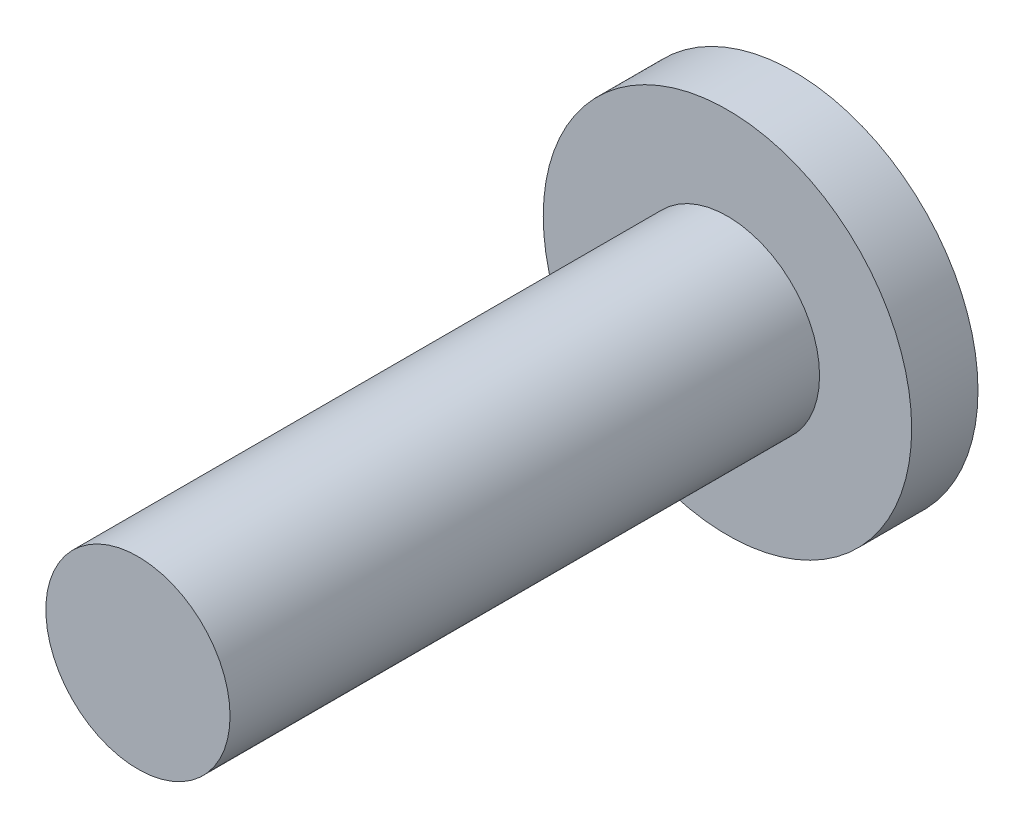
ISO-10303-21;
HEADER;
FILE_DESCRIPTION(('STEP AP214'),'2;1');
FILE_NAME('part.step','',(''),(''),'','','');
FILE_SCHEMA(('AUTOMOTIVE_DESIGN { 1 0 10303 214 1 1 1 1 }'));
ENDSEC;
DATA;
#1=APPLICATION_CONTEXT('core data for automotive mechanical design processes');
#2=APPLICATION_PROTOCOL_DEFINITION('international standard','automotive_design',2000,#1);
#3=PRODUCT_CONTEXT('',#1,'mechanical');
#4=PRODUCT('Part','Part','',(#3));
#5=PRODUCT_RELATED_PRODUCT_CATEGORY('part','',(#4));
#6=PRODUCT_DEFINITION_FORMATION('','',#4);
#7=PRODUCT_DEFINITION_CONTEXT('part definition',#1,'design');
#8=PRODUCT_DEFINITION('design','',#6,#7);
#9=PRODUCT_DEFINITION_SHAPE('','',#8);
#10=(LENGTH_UNIT() NAMED_UNIT(*) SI_UNIT(.MILLI.,.METRE.));
#11=(NAMED_UNIT(*) PLANE_ANGLE_UNIT() SI_UNIT($,.RADIAN.));
#12=(NAMED_UNIT(*) SI_UNIT($,.STERADIAN.) SOLID_ANGLE_UNIT());
#13=UNCERTAINTY_MEASURE_WITH_UNIT(LENGTH_MEASURE(1.E-05),#10,'distance_accuracy_value','');
#14=(GEOMETRIC_REPRESENTATION_CONTEXT(3) GLOBAL_UNCERTAINTY_ASSIGNED_CONTEXT((#13)) GLOBAL_UNIT_ASSIGNED_CONTEXT((#10,
#11,#12)) REPRESENTATION_CONTEXT('',''));
#15=CARTESIAN_POINT('',(0.,0.,0.));
#16=DIRECTION('',(0.,0.,1.));
#17=DIRECTION('',(1.,0.,0.));
#18=AXIS2_PLACEMENT_3D('',#15,#16,#17);
#19=CARTESIAN_POINT('',(0.,0.,0.9));
#20=DIRECTION('',(0.,0.,-1.));
#21=DIRECTION('',(-1.,0.,0.));
#22=AXIS2_PLACEMENT_3D('',#19,#20,#21);
#23=CYLINDRICAL_SURFACE('',#22,2.5);
#24=CARTESIAN_POINT('',(0.,0.,0.9));
#25=DIRECTION('',(0.,0.,1.));
#26=DIRECTION('',(1.,0.,0.));
#27=AXIS2_PLACEMENT_3D('',#24,#25,#26);
#28=CIRCLE('',#27,2.5);
#29=CARTESIAN_POINT('',(2.5,0.,0.9));
#30=VERTEX_POINT('',#29);
#31=EDGE_CURVE('E49',#30,#30,#28,.T.);
#32=ORIENTED_EDGE('',*,*,#31,.F.);
#33=EDGE_LOOP('',(#32));
#34=FACE_BOUND('',#33,.T.);
#35=CARTESIAN_POINT('',(0.,0.,0.));
#36=DIRECTION('',(0.,0.,1.));
#37=DIRECTION('',(1.,0.,0.));
#38=AXIS2_PLACEMENT_3D('',#35,#36,#37);
#39=CIRCLE('',#38,2.5);
#40=CARTESIAN_POINT('',(2.5,0.,0.));
#41=VERTEX_POINT('',#40);
#42=EDGE_CURVE('E44',#41,#41,#39,.T.);
#43=ORIENTED_EDGE('',*,*,#42,.T.);
#44=EDGE_LOOP('',(#43));
#45=FACE_BOUND('',#44,.T.);
#46=ADVANCED_FACE('F41',(#34,#45),#23,.T.);
#47=CARTESIAN_POINT('',(0.,0.,0.9));
#48=DIRECTION('',(0.,0.,1.));
#49=DIRECTION('',(1.,0.,0.));
#50=AXIS2_PLACEMENT_3D('',#47,#48,#49);
#51=PLANE('',#50);
#52=CARTESIAN_POINT('',(0.,0.,0.9));
#53=DIRECTION('',(0.,0.,1.));
#54=DIRECTION('',(1.,0.,0.));
#55=AXIS2_PLACEMENT_3D('',#52,#53,#54);
#56=CIRCLE('',#55,1.25);
#57=CARTESIAN_POINT('',(1.25,0.,0.9));
#58=VERTEX_POINT('',#57);
#59=EDGE_CURVE('E11',#58,#58,#56,.T.);
#60=ORIENTED_EDGE('',*,*,#59,.F.);
#61=EDGE_LOOP('',(#60));
#62=FACE_BOUND('',#61,.T.);
#63=ORIENTED_EDGE('',*,*,#31,.T.);
#64=EDGE_LOOP('',(#63));
#65=FACE_BOUND('',#64,.T.);
#66=ADVANCED_FACE('F161',(#62,#65),#51,.T.);
#67=CARTESIAN_POINT('',(0.,0.,0.));
#68=DIRECTION('',(0.,0.,1.));
#69=DIRECTION('',(1.,0.,0.));
#70=AXIS2_PLACEMENT_3D('',#67,#68,#69);
#71=PLANE('',#70);
#72=DIRECTION('',(0.5,0.866025403784438,0.));
#73=VECTOR('',#72,1.);
#74=CARTESIAN_POINT('',(-0.866025403784438,0.,0.));
#75=LINE('',#74,#73);
#76=CARTESIAN_POINT('',(-0.866025403784438,0.,0.));
#77=VERTEX_POINT('',#76);
#78=CARTESIAN_POINT('',(-0.433012701892219,0.75,0.));
#79=VERTEX_POINT('',#78);
#80=EDGE_CURVE('E131',#77,#79,#75,.T.);
#81=ORIENTED_EDGE('',*,*,#80,.F.);
#82=DIRECTION('',(-0.5,0.866025403784439,0.));
#83=VECTOR('',#82,1.);
#84=CARTESIAN_POINT('',(-0.433012701892219,-0.75,0.));
#85=LINE('',#84,#83);
#86=CARTESIAN_POINT('',(-0.433012701892219,-0.75,0.));
#87=VERTEX_POINT('',#86);
#88=EDGE_CURVE('E57',#87,#77,#85,.T.);
#89=ORIENTED_EDGE('',*,*,#88,.F.);
#90=DIRECTION('',(-1.,0.,0.));
#91=VECTOR('',#90,1.);
#92=CARTESIAN_POINT('',(0.433012701892219,-0.75,0.));
#93=LINE('',#92,#91);
#94=CARTESIAN_POINT('',(0.433012701892219,-0.75,0.));
#95=VERTEX_POINT('',#94);
#96=EDGE_CURVE('E140',#95,#87,#93,.T.);
#97=ORIENTED_EDGE('',*,*,#96,.F.);
#98=DIRECTION('',(-0.5,-0.866025403784439,0.));
#99=VECTOR('',#98,1.);
#100=CARTESIAN_POINT('',(0.866025403784439,0.,0.));
#101=LINE('',#100,#99);
#102=CARTESIAN_POINT('',(0.866025403784439,0.,0.));
#103=VERTEX_POINT('',#102);
#104=EDGE_CURVE('E138',#103,#95,#101,.T.);
#105=ORIENTED_EDGE('',*,*,#104,.F.);
#106=DIRECTION('',(0.5,-0.866025403784439,0.));
#107=VECTOR('',#106,1.);
#108=CARTESIAN_POINT('',(0.433012701892219,0.75,0.));
#109=LINE('',#108,#107);
#110=CARTESIAN_POINT('',(0.433012701892219,0.75,0.));
#111=VERTEX_POINT('',#110);
#112=EDGE_CURVE('E105',#111,#103,#109,.T.);
#113=ORIENTED_EDGE('',*,*,#112,.F.);
#114=DIRECTION('',(1.,0.,0.));
#115=VECTOR('',#114,1.);
#116=CARTESIAN_POINT('',(-0.433012701892219,0.75,0.));
#117=LINE('',#116,#115);
#118=EDGE_CURVE('E134',#79,#111,#117,.T.);
#119=ORIENTED_EDGE('',*,*,#118,.F.);
#120=EDGE_LOOP('',(#81,#89,#97,#105,#113,#119));
#121=FACE_BOUND('',#120,.T.);
#122=ORIENTED_EDGE('',*,*,#42,.F.);
#123=EDGE_LOOP('',(#122));
#124=FACE_BOUND('',#123,.T.);
#125=ADVANCED_FACE('F158',(#121,#124),#71,.F.);
#126=CARTESIAN_POINT('',(0.,0.,8.9));
#127=DIRECTION('',(0.,0.,-1.));
#128=DIRECTION('',(-1.,0.,0.));
#129=AXIS2_PLACEMENT_3D('',#126,#127,#128);
#130=CYLINDRICAL_SURFACE('',#129,1.25);
#131=CARTESIAN_POINT('',(0.,0.,8.9));
#132=DIRECTION('',(0.,0.,1.));
#133=DIRECTION('',(1.,0.,0.));
#134=AXIS2_PLACEMENT_3D('',#131,#132,#133);
#135=CIRCLE('',#134,1.25);
#136=CARTESIAN_POINT('',(1.25,0.,8.9));
#137=VERTEX_POINT('',#136);
#138=EDGE_CURVE('E144',#137,#137,#135,.T.);
#139=ORIENTED_EDGE('',*,*,#138,.F.);
#140=EDGE_LOOP('',(#139));
#141=FACE_BOUND('',#140,.T.);
#142=ORIENTED_EDGE('',*,*,#59,.T.);
#143=EDGE_LOOP('',(#142));
#144=FACE_BOUND('',#143,.T.);
#145=ADVANCED_FACE('F160',(#141,#144),#130,.T.);
#146=CARTESIAN_POINT('',(0.,0.,8.9));
#147=DIRECTION('',(0.,0.,1.));
#148=DIRECTION('',(1.,0.,0.));
#149=AXIS2_PLACEMENT_3D('',#146,#147,#148);
#150=PLANE('',#149);
#151=ORIENTED_EDGE('',*,*,#138,.T.);
#152=EDGE_LOOP('',(#151));
#153=FACE_BOUND('',#152,.T.);
#154=ADVANCED_FACE('F168',(#153),#150,.T.);
#155=CARTESIAN_POINT('',(-0.433012701892219,-0.75,1.));
#156=DIRECTION('',(-0.866025403784439,-0.5,0.));
#157=DIRECTION('',(0.5,-0.866025403784439,0.));
#158=AXIS2_PLACEMENT_3D('',#155,#156,#157);
#159=PLANE('',#158);
#160=ORIENTED_EDGE('',*,*,#88,.T.);
#161=DIRECTION('',(0.,0.,-1.));
#162=VECTOR('',#161,1.);
#163=CARTESIAN_POINT('',(-0.866025403784438,0.,1.));
#164=LINE('',#163,#162);
#165=CARTESIAN_POINT('',(-0.866025403784438,0.,1.));
#166=VERTEX_POINT('',#165);
#167=EDGE_CURVE('E87',#166,#77,#164,.T.);
#168=ORIENTED_EDGE('',*,*,#167,.F.);
#169=DIRECTION('',(-0.5,0.866025403784439,0.));
#170=VECTOR('',#169,1.);
#171=CARTESIAN_POINT('',(-0.433012701892219,-0.75,1.));
#172=LINE('',#171,#170);
#173=CARTESIAN_POINT('',(-0.433012701892219,-0.75,1.));
#174=VERTEX_POINT('',#173);
#175=EDGE_CURVE('E142',#174,#166,#172,.T.);
#176=ORIENTED_EDGE('',*,*,#175,.F.);
#177=DIRECTION('',(0.,0.,-1.));
#178=VECTOR('',#177,1.);
#179=CARTESIAN_POINT('',(-0.433012701892219,-0.75,1.));
#180=LINE('',#179,#178);
#181=EDGE_CURVE('E65',#174,#87,#180,.T.);
#182=ORIENTED_EDGE('',*,*,#181,.T.);
#183=EDGE_LOOP('',(#160,#168,#176,#182));
#184=FACE_BOUND('',#183,.T.);
#185=ADVANCED_FACE('F194',(#184),#159,.F.);
#186=CARTESIAN_POINT('',(0.433012701892219,-0.75,1.));
#187=DIRECTION('',(0.,-1.,0.));
#188=DIRECTION('',(1.,0.,0.));
#189=AXIS2_PLACEMENT_3D('',#186,#187,#188);
#190=PLANE('',#189);
#191=ORIENTED_EDGE('',*,*,#96,.T.);
#192=ORIENTED_EDGE('',*,*,#181,.F.);
#193=DIRECTION('',(-1.,0.,0.));
#194=VECTOR('',#193,1.);
#195=CARTESIAN_POINT('',(0.433012701892219,-0.75,1.));
#196=LINE('',#195,#194);
#197=CARTESIAN_POINT('',(0.433012701892219,-0.75,1.));
#198=VERTEX_POINT('',#197);
#199=EDGE_CURVE('E117',#198,#174,#196,.T.);
#200=ORIENTED_EDGE('',*,*,#199,.F.);
#201=DIRECTION('',(0.,0.,-1.));
#202=VECTOR('',#201,1.);
#203=CARTESIAN_POINT('',(0.433012701892219,-0.75,1.));
#204=LINE('',#203,#202);
#205=EDGE_CURVE('E109',#198,#95,#204,.T.);
#206=ORIENTED_EDGE('',*,*,#205,.T.);
#207=EDGE_LOOP('',(#191,#192,#200,#206));
#208=FACE_BOUND('',#207,.T.);
#209=ADVANCED_FACE('F206',(#208),#190,.F.);
#210=CARTESIAN_POINT('',(0.866025403784439,0.,1.));
#211=DIRECTION('',(0.866025403784439,-0.5,0.));
#212=DIRECTION('',(0.5,0.866025403784439,0.));
#213=AXIS2_PLACEMENT_3D('',#210,#211,#212);
#214=PLANE('',#213);
#215=ORIENTED_EDGE('',*,*,#104,.T.);
#216=ORIENTED_EDGE('',*,*,#205,.F.);
#217=DIRECTION('',(-0.5,-0.866025403784439,0.));
#218=VECTOR('',#217,1.);
#219=CARTESIAN_POINT('',(0.866025403784439,0.,1.));
#220=LINE('',#219,#218);
#221=CARTESIAN_POINT('',(0.866025403784439,0.,1.));
#222=VERTEX_POINT('',#221);
#223=EDGE_CURVE('E113',#222,#198,#220,.T.);
#224=ORIENTED_EDGE('',*,*,#223,.F.);
#225=DIRECTION('',(0.,0.,-1.));
#226=VECTOR('',#225,1.);
#227=CARTESIAN_POINT('',(0.866025403784439,0.,1.));
#228=LINE('',#227,#226);
#229=EDGE_CURVE('E98',#222,#103,#228,.T.);
#230=ORIENTED_EDGE('',*,*,#229,.T.);
#231=EDGE_LOOP('',(#215,#216,#224,#230));
#232=FACE_BOUND('',#231,.T.);
#233=ADVANCED_FACE('F114',(#232),#214,.F.);
#234=CARTESIAN_POINT('',(0.433012701892219,0.75,1.));
#235=DIRECTION('',(0.866025403784439,0.5,0.));
#236=DIRECTION('',(-0.5,0.866025403784439,0.));
#237=AXIS2_PLACEMENT_3D('',#234,#235,#236);
#238=PLANE('',#237);
#239=ORIENTED_EDGE('',*,*,#112,.T.);
#240=ORIENTED_EDGE('',*,*,#229,.F.);
#241=DIRECTION('',(0.5,-0.866025403784439,0.));
#242=VECTOR('',#241,1.);
#243=CARTESIAN_POINT('',(0.433012701892219,0.75,1.));
#244=LINE('',#243,#242);
#245=CARTESIAN_POINT('',(0.433012701892219,0.75,1.));
#246=VERTEX_POINT('',#245);
#247=EDGE_CURVE('E102',#246,#222,#244,.T.);
#248=ORIENTED_EDGE('',*,*,#247,.F.);
#249=DIRECTION('',(0.,0.,-1.));
#250=VECTOR('',#249,1.);
#251=CARTESIAN_POINT('',(0.433012701892219,0.75,1.));
#252=LINE('',#251,#250);
#253=EDGE_CURVE('E110',#246,#111,#252,.T.);
#254=ORIENTED_EDGE('',*,*,#253,.T.);
#255=EDGE_LOOP('',(#239,#240,#248,#254));
#256=FACE_BOUND('',#255,.T.);
#257=ADVANCED_FACE('F100',(#256),#238,.F.);
#258=CARTESIAN_POINT('',(-0.433012701892219,0.75,1.));
#259=DIRECTION('',(0.,1.,0.));
#260=DIRECTION('',(0.,0.,1.));
#261=AXIS2_PLACEMENT_3D('',#258,#259,#260);
#262=PLANE('',#261);
#263=ORIENTED_EDGE('',*,*,#118,.T.);
#264=ORIENTED_EDGE('',*,*,#253,.F.);
#265=DIRECTION('',(1.,0.,0.));
#266=VECTOR('',#265,1.);
#267=CARTESIAN_POINT('',(-0.433012701892219,0.75,1.));
#268=LINE('',#267,#266);
#269=CARTESIAN_POINT('',(-0.433012701892219,0.75,1.));
#270=VERTEX_POINT('',#269);
#271=EDGE_CURVE('E123',#270,#246,#268,.T.);
#272=ORIENTED_EDGE('',*,*,#271,.F.);
#273=DIRECTION('',(0.,0.,-1.));
#274=VECTOR('',#273,1.);
#275=CARTESIAN_POINT('',(-0.433012701892219,0.75,1.));
#276=LINE('',#275,#274);
#277=EDGE_CURVE('E147',#270,#79,#276,.T.);
#278=ORIENTED_EDGE('',*,*,#277,.T.);
#279=EDGE_LOOP('',(#263,#264,#272,#278));
#280=FACE_BOUND('',#279,.T.);
#281=ADVANCED_FACE('F231',(#280),#262,.F.);
#282=CARTESIAN_POINT('',(-0.866025403784438,0.,1.));
#283=DIRECTION('',(-0.866025403784438,0.5,0.));
#284=DIRECTION('',(-0.5,-0.866025403784439,0.));
#285=AXIS2_PLACEMENT_3D('',#282,#283,#284);
#286=PLANE('',#285);
#287=ORIENTED_EDGE('',*,*,#80,.T.);
#288=ORIENTED_EDGE('',*,*,#277,.F.);
#289=DIRECTION('',(0.5,0.866025403784438,0.));
#290=VECTOR('',#289,1.);
#291=CARTESIAN_POINT('',(-0.866025403784438,0.,1.));
#292=LINE('',#291,#290);
#293=EDGE_CURVE('E125',#166,#270,#292,.T.);
#294=ORIENTED_EDGE('',*,*,#293,.F.);
#295=ORIENTED_EDGE('',*,*,#167,.T.);
#296=EDGE_LOOP('',(#287,#288,#294,#295));
#297=FACE_BOUND('',#296,.T.);
#298=ADVANCED_FACE('F240',(#297),#286,.F.);
#299=CARTESIAN_POINT('',(0.,0.,1.));
#300=DIRECTION('',(0.,0.,-1.));
#301=DIRECTION('',(-1.,0.,0.));
#302=AXIS2_PLACEMENT_3D('',#299,#300,#301);
#303=PLANE('',#302);
#304=ORIENTED_EDGE('',*,*,#175,.T.);
#305=ORIENTED_EDGE('',*,*,#293,.T.);
#306=ORIENTED_EDGE('',*,*,#271,.T.);
#307=ORIENTED_EDGE('',*,*,#247,.T.);
#308=ORIENTED_EDGE('',*,*,#223,.T.);
#309=ORIENTED_EDGE('',*,*,#199,.T.);
#310=EDGE_LOOP('',(#304,#305,#306,#307,#308,#309));
#311=FACE_BOUND('',#310,.T.);
#312=ADVANCED_FACE('F120',(#311),#303,.T.);
#313=CLOSED_SHELL('',(#46,#66,#125,#145,#154,#185,#209,#233,#257,#281,#298,#312));
#314=MANIFOLD_SOLID_BREP('B2',#313);
#315=ADVANCED_BREP_SHAPE_REPRESENTATION('',(#18,#314),#14);
#316=SHAPE_DEFINITION_REPRESENTATION(#9,#315);
ENDSEC;
END-ISO-10303-21;
